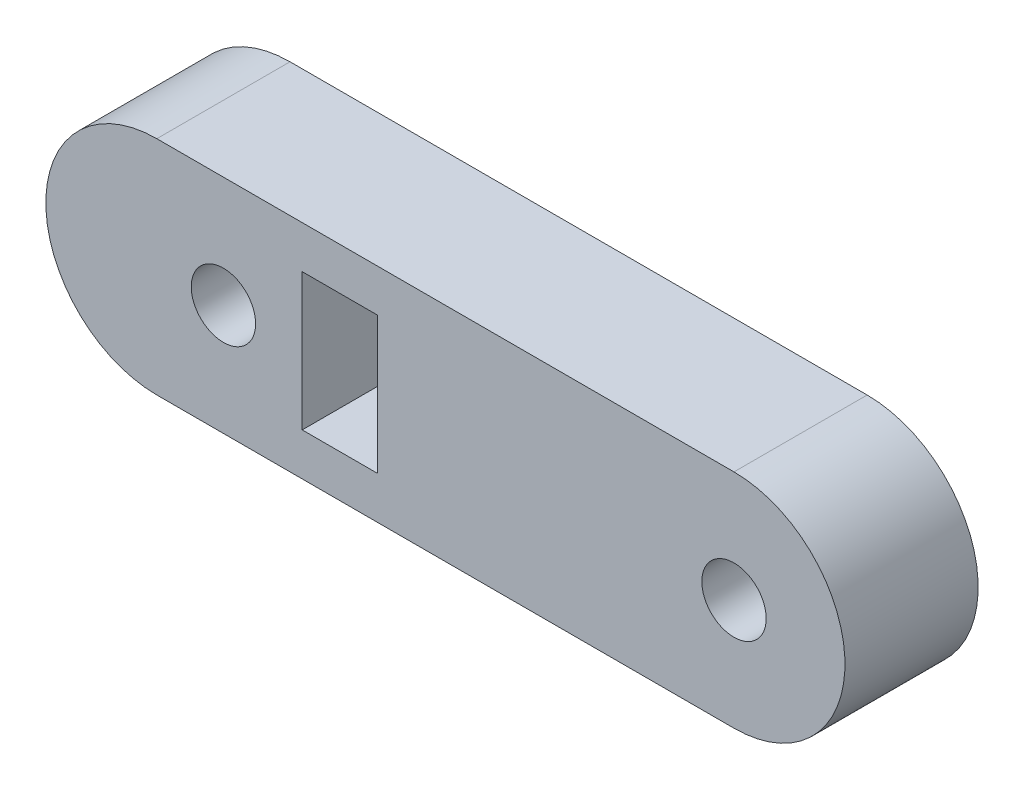
ISO-10303-21;
HEADER;
FILE_DESCRIPTION(('STEP AP214'),'2;1');
FILE_NAME('part.step','',(''),(''),'','','');
FILE_SCHEMA(('AUTOMOTIVE_DESIGN { 1 0 10303 214 1 1 1 1 }'));
ENDSEC;
DATA;
#1=APPLICATION_CONTEXT('core data for automotive mechanical design processes');
#2=APPLICATION_PROTOCOL_DEFINITION('international standard','automotive_design',2000,#1);
#3=PRODUCT_CONTEXT('',#1,'mechanical');
#4=PRODUCT('Part','Part','',(#3));
#5=PRODUCT_RELATED_PRODUCT_CATEGORY('part','',(#4));
#6=PRODUCT_DEFINITION_FORMATION('','',#4);
#7=PRODUCT_DEFINITION_CONTEXT('part definition',#1,'design');
#8=PRODUCT_DEFINITION('design','',#6,#7);
#9=PRODUCT_DEFINITION_SHAPE('','',#8);
#10=(LENGTH_UNIT() NAMED_UNIT(*) SI_UNIT(.MILLI.,.METRE.));
#11=(NAMED_UNIT(*) PLANE_ANGLE_UNIT() SI_UNIT($,.RADIAN.));
#12=(NAMED_UNIT(*) SI_UNIT($,.STERADIAN.) SOLID_ANGLE_UNIT());
#13=UNCERTAINTY_MEASURE_WITH_UNIT(LENGTH_MEASURE(1.E-05),#10,'distance_accuracy_value','');
#14=(GEOMETRIC_REPRESENTATION_CONTEXT(3) GLOBAL_UNCERTAINTY_ASSIGNED_CONTEXT((#13)) GLOBAL_UNIT_ASSIGNED_CONTEXT((#10,
#11,#12)) REPRESENTATION_CONTEXT('',''));
#15=CARTESIAN_POINT('',(0.,0.,0.));
#16=DIRECTION('',(0.,0.,1.));
#17=DIRECTION('',(1.,0.,0.));
#18=AXIS2_PLACEMENT_3D('',#15,#16,#17);
#19=CARTESIAN_POINT('',(586.771387999998,460.482899,6.));
#20=DIRECTION('',(0.,0.,1.));
#21=DIRECTION('',(1.,0.,0.));
#22=AXIS2_PLACEMENT_3D('',#19,#20,#21);
#23=PLANE('',#22);
#24=CARTESIAN_POINT('',(612.771387999999,460.482899,6.));
#25=DIRECTION('',(0.,0.,1.));
#26=DIRECTION('',(1.,0.,0.));
#27=AXIS2_PLACEMENT_3D('',#24,#25,#26);
#28=CIRCLE('',#27,1.44999999999994);
#29=CARTESIAN_POINT('',(614.221387999999,460.482899,6.));
#30=VERTEX_POINT('',#29);
#31=EDGE_CURVE('E148',#30,#30,#28,.T.);
#32=ORIENTED_EDGE('',*,*,#31,.F.);
#33=EDGE_LOOP('',(#32));
#34=FACE_BOUND('',#33,.T.);
#35=DIRECTION('',(1.,0.,0.));
#36=VECTOR('',#35,1.);
#37=CARTESIAN_POINT('',(589.771387999999,455.482899,6.));
#38=LINE('',#37,#36);
#39=CARTESIAN_POINT('',(586.771387999998,455.482899,6.));
#40=VERTEX_POINT('',#39);
#41=CARTESIAN_POINT('',(612.771387999999,455.482899,6.));
#42=VERTEX_POINT('',#41);
#43=EDGE_CURVE('E160',#40,#42,#38,.T.);
#44=ORIENTED_EDGE('',*,*,#43,.T.);
#45=CARTESIAN_POINT('',(612.771387999999,460.482899,6.));
#46=DIRECTION('',(0.,0.,1.));
#47=DIRECTION('',(1.,0.,0.));
#48=AXIS2_PLACEMENT_3D('',#45,#46,#47);
#49=CIRCLE('',#48,5.00000000000006);
#50=CARTESIAN_POINT('',(612.771387999999,465.482899,6.));
#51=VERTEX_POINT('',#50);
#52=EDGE_CURVE('E164',#42,#51,#49,.T.);
#53=ORIENTED_EDGE('',*,*,#52,.T.);
#54=DIRECTION('',(-1.,0.,0.));
#55=VECTOR('',#54,1.);
#56=CARTESIAN_POINT('',(589.771387999999,465.482899,6.));
#57=LINE('',#56,#55);
#58=CARTESIAN_POINT('',(586.771387999998,465.482899,6.));
#59=VERTEX_POINT('',#58);
#60=EDGE_CURVE('E169',#51,#59,#57,.T.);
#61=ORIENTED_EDGE('',*,*,#60,.T.);
#62=CARTESIAN_POINT('',(586.771387999998,460.482899,6.));
#63=DIRECTION('',(0.,0.,1.));
#64=DIRECTION('',(1.,0.,0.));
#65=AXIS2_PLACEMENT_3D('',#62,#63,#64);
#66=CIRCLE('',#65,5.00000000000006);
#67=EDGE_CURVE('E173',#59,#40,#66,.T.);
#68=ORIENTED_EDGE('',*,*,#67,.T.);
#69=EDGE_LOOP('',(#44,#53,#61,#68));
#70=FACE_BOUND('',#69,.T.);
#71=CARTESIAN_POINT('',(589.771387999998,460.482899,6.));
#72=DIRECTION('',(0.,0.,1.));
#73=DIRECTION('',(1.,0.,0.));
#74=AXIS2_PLACEMENT_3D('',#71,#72,#73);
#75=CIRCLE('',#74,1.45000000000014);
#76=CARTESIAN_POINT('',(591.221387999999,460.482899,6.));
#77=VERTEX_POINT('',#76);
#78=EDGE_CURVE('E181',#77,#77,#75,.T.);
#79=ORIENTED_EDGE('',*,*,#78,.F.);
#80=EDGE_LOOP('',(#79));
#81=FACE_BOUND('',#80,.T.);
#82=DIRECTION('',(0.,-1.,0.));
#83=VECTOR('',#82,1.);
#84=CARTESIAN_POINT('',(593.321388,457.396168,6.));
#85=LINE('',#84,#83);
#86=CARTESIAN_POINT('',(593.321388,463.56963,6.));
#87=VERTEX_POINT('',#86);
#88=CARTESIAN_POINT('',(593.321388,457.396168,6.));
#89=VERTEX_POINT('',#88);
#90=EDGE_CURVE('E108',#87,#89,#85,.T.);
#91=ORIENTED_EDGE('',*,*,#90,.F.);
#92=DIRECTION('',(-1.,0.,0.));
#93=VECTOR('',#92,1.);
#94=CARTESIAN_POINT('',(593.321388,463.56963,6.));
#95=LINE('',#94,#93);
#96=CARTESIAN_POINT('',(596.721398999991,463.56963,6.));
#97=VERTEX_POINT('',#96);
#98=EDGE_CURVE('E99',#97,#87,#95,.T.);
#99=ORIENTED_EDGE('',*,*,#98,.F.);
#100=DIRECTION('',(-1.45668775469319E-12,1.,0.));
#101=VECTOR('',#100,1.);
#102=CARTESIAN_POINT('',(596.721398999991,463.56963,6.));
#103=LINE('',#102,#101);
#104=CARTESIAN_POINT('',(596.721399,457.396168,6.));
#105=VERTEX_POINT('',#104);
#106=EDGE_CURVE('E125',#105,#97,#103,.T.);
#107=ORIENTED_EDGE('',*,*,#106,.F.);
#108=DIRECTION('',(1.,0.,0.));
#109=VECTOR('',#108,1.);
#110=CARTESIAN_POINT('',(596.721399,457.396168,6.));
#111=LINE('',#110,#109);
#112=EDGE_CURVE('E120',#89,#105,#111,.T.);
#113=ORIENTED_EDGE('',*,*,#112,.F.);
#114=EDGE_LOOP('',(#91,#99,#107,#113));
#115=FACE_BOUND('',#114,.T.);
#116=ADVANCED_FACE('F34',(#34,#70,#81,#115),#23,.T.);
#117=CARTESIAN_POINT('',(586.771387999998,460.482899,0.));
#118=DIRECTION('',(0.,0.,1.));
#119=DIRECTION('',(1.,0.,0.));
#120=AXIS2_PLACEMENT_3D('',#117,#118,#119);
#121=PLANE('',#120);
#122=CARTESIAN_POINT('',(612.771387999999,460.482899,0.));
#123=DIRECTION('',(0.,0.,1.));
#124=DIRECTION('',(1.,0.,0.));
#125=AXIS2_PLACEMENT_3D('',#122,#123,#124);
#126=CIRCLE('',#125,1.44999999999994);
#127=CARTESIAN_POINT('',(614.221387999999,460.482899,0.));
#128=VERTEX_POINT('',#127);
#129=EDGE_CURVE('E116',#128,#128,#126,.T.);
#130=ORIENTED_EDGE('',*,*,#129,.T.);
#131=EDGE_LOOP('',(#130));
#132=FACE_BOUND('',#131,.T.);
#133=DIRECTION('',(1.,0.,0.));
#134=VECTOR('',#133,1.);
#135=CARTESIAN_POINT('',(589.771387999999,455.482899,0.));
#136=LINE('',#135,#134);
#137=CARTESIAN_POINT('',(586.771387999998,455.482899,0.));
#138=VERTEX_POINT('',#137);
#139=CARTESIAN_POINT('',(612.771387999999,455.482899,0.));
#140=VERTEX_POINT('',#139);
#141=EDGE_CURVE('E178',#138,#140,#136,.T.);
#142=ORIENTED_EDGE('',*,*,#141,.F.);
#143=CARTESIAN_POINT('',(586.771387999998,460.482899,0.));
#144=DIRECTION('',(0.,0.,1.));
#145=DIRECTION('',(1.,0.,0.));
#146=AXIS2_PLACEMENT_3D('',#143,#144,#145);
#147=CIRCLE('',#146,5.00000000000006);
#148=CARTESIAN_POINT('',(586.771387999998,465.482899,0.));
#149=VERTEX_POINT('',#148);
#150=EDGE_CURVE('E165',#149,#138,#147,.T.);
#151=ORIENTED_EDGE('',*,*,#150,.F.);
#152=DIRECTION('',(-1.,0.,0.));
#153=VECTOR('',#152,1.);
#154=CARTESIAN_POINT('',(589.771387999999,465.482899,0.));
#155=LINE('',#154,#153);
#156=CARTESIAN_POINT('',(612.771387999999,465.482899,0.));
#157=VERTEX_POINT('',#156);
#158=EDGE_CURVE('E184',#157,#149,#155,.T.);
#159=ORIENTED_EDGE('',*,*,#158,.F.);
#160=CARTESIAN_POINT('',(612.771387999999,460.482899,0.));
#161=DIRECTION('',(0.,0.,1.));
#162=DIRECTION('',(1.,0.,0.));
#163=AXIS2_PLACEMENT_3D('',#160,#161,#162);
#164=CIRCLE('',#163,5.00000000000006);
#165=EDGE_CURVE('E180',#140,#157,#164,.T.);
#166=ORIENTED_EDGE('',*,*,#165,.F.);
#167=EDGE_LOOP('',(#142,#151,#159,#166));
#168=FACE_BOUND('',#167,.T.);
#169=CARTESIAN_POINT('',(589.771387999998,460.482899,0.));
#170=DIRECTION('',(0.,0.,1.));
#171=DIRECTION('',(1.,0.,0.));
#172=AXIS2_PLACEMENT_3D('',#169,#170,#171);
#173=CIRCLE('',#172,1.45000000000014);
#174=CARTESIAN_POINT('',(591.221387999999,460.482899,0.));
#175=VERTEX_POINT('',#174);
#176=EDGE_CURVE('E153',#175,#175,#173,.T.);
#177=ORIENTED_EDGE('',*,*,#176,.T.);
#178=EDGE_LOOP('',(#177));
#179=FACE_BOUND('',#178,.T.);
#180=DIRECTION('',(-1.,0.,0.));
#181=VECTOR('',#180,1.);
#182=CARTESIAN_POINT('',(593.321388,463.56963,0.));
#183=LINE('',#182,#181);
#184=CARTESIAN_POINT('',(596.721398999991,463.56963,0.));
#185=VERTEX_POINT('',#184);
#186=CARTESIAN_POINT('',(593.321388,463.56963,0.));
#187=VERTEX_POINT('',#186);
#188=EDGE_CURVE('E57',#185,#187,#183,.T.);
#189=ORIENTED_EDGE('',*,*,#188,.T.);
#190=DIRECTION('',(0.,-1.,0.));
#191=VECTOR('',#190,1.);
#192=CARTESIAN_POINT('',(593.321388,457.396168,0.));
#193=LINE('',#192,#191);
#194=CARTESIAN_POINT('',(593.321388,457.396168,0.));
#195=VERTEX_POINT('',#194);
#196=EDGE_CURVE('E115',#187,#195,#193,.T.);
#197=ORIENTED_EDGE('',*,*,#196,.T.);
#198=DIRECTION('',(1.,0.,0.));
#199=VECTOR('',#198,1.);
#200=CARTESIAN_POINT('',(596.721399,457.396168,0.));
#201=LINE('',#200,#199);
#202=CARTESIAN_POINT('',(596.721399,457.396168,0.));
#203=VERTEX_POINT('',#202);
#204=EDGE_CURVE('E140',#195,#203,#201,.T.);
#205=ORIENTED_EDGE('',*,*,#204,.T.);
#206=DIRECTION('',(-1.45668775469319E-12,1.,0.));
#207=VECTOR('',#206,1.);
#208=CARTESIAN_POINT('',(596.721398999991,463.56963,0.));
#209=LINE('',#208,#207);
#210=EDGE_CURVE('E109',#203,#185,#209,.T.);
#211=ORIENTED_EDGE('',*,*,#210,.T.);
#212=EDGE_LOOP('',(#189,#197,#205,#211));
#213=FACE_BOUND('',#212,.T.);
#214=ADVANCED_FACE('F204',(#132,#168,#179,#213),#121,.F.);
#215=CARTESIAN_POINT('',(589.771387999999,455.482899,6.));
#216=DIRECTION('',(0.,1.,0.));
#217=DIRECTION('',(-1.,0.,0.));
#218=AXIS2_PLACEMENT_3D('',#215,#216,#217);
#219=PLANE('',#218);
#220=ORIENTED_EDGE('',*,*,#141,.T.);
#221=DIRECTION('',(0.,0.,-1.));
#222=VECTOR('',#221,1.);
#223=CARTESIAN_POINT('',(612.771387999999,455.482899,6.));
#224=LINE('',#223,#222);
#225=EDGE_CURVE('E12',#42,#140,#224,.T.);
#226=ORIENTED_EDGE('',*,*,#225,.F.);
#227=ORIENTED_EDGE('',*,*,#43,.F.);
#228=DIRECTION('',(0.,0.,-1.));
#229=VECTOR('',#228,1.);
#230=CARTESIAN_POINT('',(586.771387999998,455.482899,6.));
#231=LINE('',#230,#229);
#232=EDGE_CURVE('E177',#40,#138,#231,.T.);
#233=ORIENTED_EDGE('',*,*,#232,.T.);
#234=EDGE_LOOP('',(#220,#226,#227,#233));
#235=FACE_BOUND('',#234,.T.);
#236=ADVANCED_FACE('F36',(#235),#219,.F.);
#237=CARTESIAN_POINT('',(612.771387999999,460.482899,6.));
#238=DIRECTION('',(0.,0.,-1.));
#239=DIRECTION('',(-1.,0.,0.));
#240=AXIS2_PLACEMENT_3D('',#237,#238,#239);
#241=CYLINDRICAL_SURFACE('',#240,5.00000000000006);
#242=ORIENTED_EDGE('',*,*,#165,.T.);
#243=DIRECTION('',(0.,0.,-1.));
#244=VECTOR('',#243,1.);
#245=CARTESIAN_POINT('',(612.771387999999,465.482899,6.));
#246=LINE('',#245,#244);
#247=EDGE_CURVE('E42',#51,#157,#246,.T.);
#248=ORIENTED_EDGE('',*,*,#247,.F.);
#249=ORIENTED_EDGE('',*,*,#52,.F.);
#250=ORIENTED_EDGE('',*,*,#225,.T.);
#251=EDGE_LOOP('',(#242,#248,#249,#250));
#252=FACE_BOUND('',#251,.T.);
#253=ADVANCED_FACE('F200',(#252),#241,.T.);
#254=CARTESIAN_POINT('',(589.771387999999,465.482899,6.));
#255=DIRECTION('',(0.,-1.,0.));
#256=DIRECTION('',(1.,0.,0.));
#257=AXIS2_PLACEMENT_3D('',#254,#255,#256);
#258=PLANE('',#257);
#259=ORIENTED_EDGE('',*,*,#158,.T.);
#260=DIRECTION('',(0.,0.,-1.));
#261=VECTOR('',#260,1.);
#262=CARTESIAN_POINT('',(586.771387999998,465.482899,6.));
#263=LINE('',#262,#261);
#264=EDGE_CURVE('E190',#59,#149,#263,.T.);
#265=ORIENTED_EDGE('',*,*,#264,.F.);
#266=ORIENTED_EDGE('',*,*,#60,.F.);
#267=ORIENTED_EDGE('',*,*,#247,.T.);
#268=EDGE_LOOP('',(#259,#265,#266,#267));
#269=FACE_BOUND('',#268,.T.);
#270=ADVANCED_FACE('F196',(#269),#258,.F.);
#271=CARTESIAN_POINT('',(586.771387999998,460.482899,6.));
#272=DIRECTION('',(0.,0.,-1.));
#273=DIRECTION('',(-1.,0.,0.));
#274=AXIS2_PLACEMENT_3D('',#271,#272,#273);
#275=CYLINDRICAL_SURFACE('',#274,5.00000000000006);
#276=ORIENTED_EDGE('',*,*,#150,.T.);
#277=ORIENTED_EDGE('',*,*,#232,.F.);
#278=ORIENTED_EDGE('',*,*,#67,.F.);
#279=ORIENTED_EDGE('',*,*,#264,.T.);
#280=EDGE_LOOP('',(#276,#277,#278,#279));
#281=FACE_BOUND('',#280,.T.);
#282=ADVANCED_FACE('F209',(#281),#275,.T.);
#283=CARTESIAN_POINT('',(589.771387999998,460.482899,6.));
#284=DIRECTION('',(0.,0.,-1.));
#285=DIRECTION('',(-1.,0.,0.));
#286=AXIS2_PLACEMENT_3D('',#283,#284,#285);
#287=CYLINDRICAL_SURFACE('',#286,1.45000000000014);
#288=ORIENTED_EDGE('',*,*,#78,.T.);
#289=EDGE_LOOP('',(#288));
#290=FACE_BOUND('',#289,.T.);
#291=ORIENTED_EDGE('',*,*,#176,.F.);
#292=EDGE_LOOP('',(#291));
#293=FACE_BOUND('',#292,.T.);
#294=ADVANCED_FACE('F226',(#290,#293),#287,.F.);
#295=CARTESIAN_POINT('',(612.771387999999,460.482899,6.));
#296=DIRECTION('',(0.,0.,-1.));
#297=DIRECTION('',(-1.,0.,0.));
#298=AXIS2_PLACEMENT_3D('',#295,#296,#297);
#299=CYLINDRICAL_SURFACE('',#298,1.44999999999994);
#300=ORIENTED_EDGE('',*,*,#31,.T.);
#301=EDGE_LOOP('',(#300));
#302=FACE_BOUND('',#301,.T.);
#303=ORIENTED_EDGE('',*,*,#129,.F.);
#304=EDGE_LOOP('',(#303));
#305=FACE_BOUND('',#304,.T.);
#306=ADVANCED_FACE('F228',(#302,#305),#299,.F.);
#307=CARTESIAN_POINT('',(593.321388,463.56963,6.));
#308=DIRECTION('',(0.,-1.,0.));
#309=DIRECTION('',(0.,0.,-1.));
#310=AXIS2_PLACEMENT_3D('',#307,#308,#309);
#311=PLANE('',#310);
#312=ORIENTED_EDGE('',*,*,#188,.F.);
#313=DIRECTION('',(0.,0.,-1.));
#314=VECTOR('',#313,1.);
#315=CARTESIAN_POINT('',(596.721398999991,463.56963,6.));
#316=LINE('',#315,#314);
#317=EDGE_CURVE('E103',#97,#185,#316,.T.);
#318=ORIENTED_EDGE('',*,*,#317,.F.);
#319=ORIENTED_EDGE('',*,*,#98,.T.);
#320=DIRECTION('',(0.,0.,-1.));
#321=VECTOR('',#320,1.);
#322=CARTESIAN_POINT('',(593.321388,463.56963,6.));
#323=LINE('',#322,#321);
#324=EDGE_CURVE('E102',#87,#187,#323,.T.);
#325=ORIENTED_EDGE('',*,*,#324,.T.);
#326=EDGE_LOOP('',(#312,#318,#319,#325));
#327=FACE_BOUND('',#326,.T.);
#328=ADVANCED_FACE('F101',(#327),#311,.T.);
#329=CARTESIAN_POINT('',(593.321388,457.396168,6.));
#330=DIRECTION('',(1.,0.,0.));
#331=DIRECTION('',(0.,0.,-1.));
#332=AXIS2_PLACEMENT_3D('',#329,#330,#331);
#333=PLANE('',#332);
#334=ORIENTED_EDGE('',*,*,#196,.F.);
#335=ORIENTED_EDGE('',*,*,#324,.F.);
#336=ORIENTED_EDGE('',*,*,#90,.T.);
#337=DIRECTION('',(0.,0.,-1.));
#338=VECTOR('',#337,1.);
#339=CARTESIAN_POINT('',(593.321388,457.396168,6.));
#340=LINE('',#339,#338);
#341=EDGE_CURVE('E117',#89,#195,#340,.T.);
#342=ORIENTED_EDGE('',*,*,#341,.T.);
#343=EDGE_LOOP('',(#334,#335,#336,#342));
#344=FACE_BOUND('',#343,.T.);
#345=ADVANCED_FACE('F112',(#344),#333,.T.);
#346=CARTESIAN_POINT('',(596.721399,457.396168,6.));
#347=DIRECTION('',(0.,1.,0.));
#348=DIRECTION('',(0.,0.,1.));
#349=AXIS2_PLACEMENT_3D('',#346,#347,#348);
#350=PLANE('',#349);
#351=ORIENTED_EDGE('',*,*,#204,.F.);
#352=ORIENTED_EDGE('',*,*,#341,.F.);
#353=ORIENTED_EDGE('',*,*,#112,.T.);
#354=DIRECTION('',(0.,0.,-1.));
#355=VECTOR('',#354,1.);
#356=CARTESIAN_POINT('',(596.721399,457.396168,6.));
#357=LINE('',#356,#355);
#358=EDGE_CURVE('E49',#105,#203,#357,.T.);
#359=ORIENTED_EDGE('',*,*,#358,.T.);
#360=EDGE_LOOP('',(#351,#352,#353,#359));
#361=FACE_BOUND('',#360,.T.);
#362=ADVANCED_FACE('F306',(#361),#350,.T.);
#363=CARTESIAN_POINT('',(596.721398999991,463.56963,6.));
#364=DIRECTION('',(-1.,-1.45668775469319E-12,0.));
#365=DIRECTION('',(1.45668775469319E-12,-1.,0.));
#366=AXIS2_PLACEMENT_3D('',#363,#364,#365);
#367=PLANE('',#366);
#368=ORIENTED_EDGE('',*,*,#210,.F.);
#369=ORIENTED_EDGE('',*,*,#358,.F.);
#370=ORIENTED_EDGE('',*,*,#106,.T.);
#371=ORIENTED_EDGE('',*,*,#317,.T.);
#372=EDGE_LOOP('',(#368,#369,#370,#371));
#373=FACE_BOUND('',#372,.T.);
#374=ADVANCED_FACE('F314',(#373),#367,.T.);
#375=CLOSED_SHELL('',(#116,#214,#236,#253,#270,#282,#294,#306,#328,#345,#362,#374));
#376=MANIFOLD_SOLID_BREP('B2',#375);
#377=ADVANCED_BREP_SHAPE_REPRESENTATION('',(#18,#376),#14);
#378=SHAPE_DEFINITION_REPRESENTATION(#9,#377);
ENDSEC;
END-ISO-10303-21;
